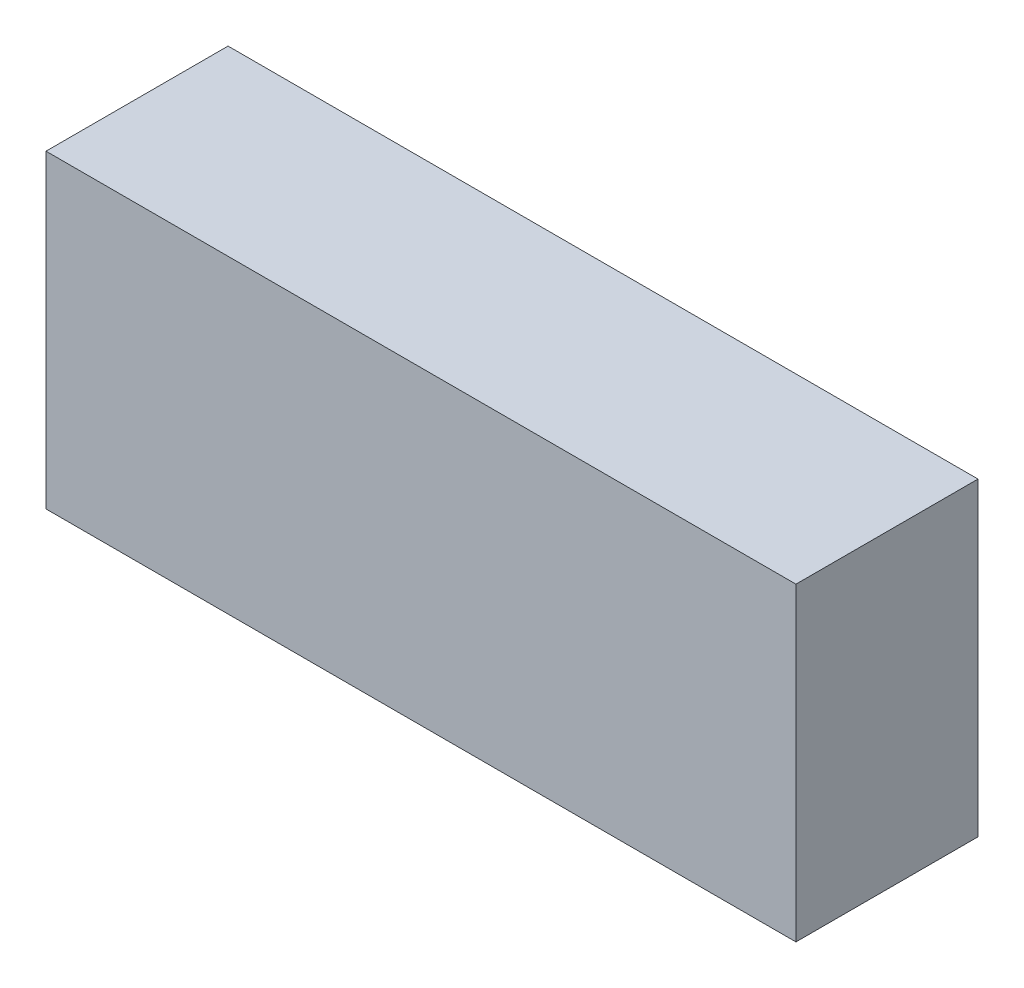
ISO-10303-21;
HEADER;
FILE_DESCRIPTION(('STEP AP214'),'2;1');
FILE_NAME('part.step','',(''),(''),'','','');
FILE_SCHEMA(('AUTOMOTIVE_DESIGN { 1 0 10303 214 1 1 1 1 }'));
ENDSEC;
DATA;
#1=APPLICATION_CONTEXT('core data for automotive mechanical design processes');
#2=APPLICATION_PROTOCOL_DEFINITION('international standard','automotive_design',2000,#1);
#3=PRODUCT_CONTEXT('',#1,'mechanical');
#4=PRODUCT('Part','Part','',(#3));
#5=PRODUCT_RELATED_PRODUCT_CATEGORY('part','',(#4));
#6=PRODUCT_DEFINITION_FORMATION('','',#4);
#7=PRODUCT_DEFINITION_CONTEXT('part definition',#1,'design');
#8=PRODUCT_DEFINITION('design','',#6,#7);
#9=PRODUCT_DEFINITION_SHAPE('','',#8);
#10=(LENGTH_UNIT() NAMED_UNIT(*) SI_UNIT(.MILLI.,.METRE.));
#11=(NAMED_UNIT(*) PLANE_ANGLE_UNIT() SI_UNIT($,.RADIAN.));
#12=(NAMED_UNIT(*) SI_UNIT($,.STERADIAN.) SOLID_ANGLE_UNIT());
#13=UNCERTAINTY_MEASURE_WITH_UNIT(LENGTH_MEASURE(1.E-05),#10,'distance_accuracy_value','');
#14=(GEOMETRIC_REPRESENTATION_CONTEXT(3) GLOBAL_UNCERTAINTY_ASSIGNED_CONTEXT((#13)) GLOBAL_UNIT_ASSIGNED_CONTEXT((#10,
#11,#12)) REPRESENTATION_CONTEXT('',''));
#15=CARTESIAN_POINT('',(0.,0.,0.));
#16=DIRECTION('',(0.,0.,1.));
#17=DIRECTION('',(1.,0.,0.));
#18=AXIS2_PLACEMENT_3D('',#15,#16,#17);
#19=CARTESIAN_POINT('',(61.7894487642175,25.5292540412383,30.));
#20=DIRECTION('',(-1.,0.,0.));
#21=DIRECTION('',(0.,0.,1.));
#22=AXIS2_PLACEMENT_3D('',#19,#20,#21);
#23=PLANE('',#22);
#24=DIRECTION('',(0.,1.,0.));
#25=VECTOR('',#24,1.);
#26=CARTESIAN_POINT('',(61.7894487642175,25.5292540412383,0.));
#27=LINE('',#26,#25);
#28=CARTESIAN_POINT('',(61.7894487642175,-25.5292540412383,0.));
#29=VERTEX_POINT('',#28);
#30=CARTESIAN_POINT('',(61.7894487642175,25.5292540412383,0.));
#31=VERTEX_POINT('',#30);
#32=EDGE_CURVE('E96',#29,#31,#27,.T.);
#33=ORIENTED_EDGE('',*,*,#32,.T.);
#34=DIRECTION('',(0.,0.,-1.));
#35=VECTOR('',#34,1.);
#36=CARTESIAN_POINT('',(61.7894487642175,25.5292540412383,30.));
#37=LINE('',#36,#35);
#38=CARTESIAN_POINT('',(61.7894487642175,25.5292540412383,30.));
#39=VERTEX_POINT('',#38);
#40=EDGE_CURVE('E11',#39,#31,#37,.T.);
#41=ORIENTED_EDGE('',*,*,#40,.F.);
#42=DIRECTION('',(0.,1.,0.));
#43=VECTOR('',#42,1.);
#44=CARTESIAN_POINT('',(61.7894487642175,25.5292540412383,30.));
#45=LINE('',#44,#43);
#46=CARTESIAN_POINT('',(61.7894487642175,-25.5292540412383,30.));
#47=VERTEX_POINT('',#46);
#48=EDGE_CURVE('E84',#47,#39,#45,.T.);
#49=ORIENTED_EDGE('',*,*,#48,.F.);
#50=DIRECTION('',(0.,0.,-1.));
#51=VECTOR('',#50,1.);
#52=CARTESIAN_POINT('',(61.7894487642175,-25.5292540412383,30.));
#53=LINE('',#52,#51);
#54=EDGE_CURVE('E92',#47,#29,#53,.T.);
#55=ORIENTED_EDGE('',*,*,#54,.T.);
#56=EDGE_LOOP('',(#33,#41,#49,#55));
#57=FACE_BOUND('',#56,.T.);
#58=ADVANCED_FACE('F33',(#57),#23,.F.);
#59=CARTESIAN_POINT('',(-61.7894487642175,25.5292540412383,30.));
#60=DIRECTION('',(0.,-1.,0.));
#61=DIRECTION('',(0.,0.,-1.));
#62=AXIS2_PLACEMENT_3D('',#59,#60,#61);
#63=PLANE('',#62);
#64=DIRECTION('',(-1.,0.,0.));
#65=VECTOR('',#64,1.);
#66=CARTESIAN_POINT('',(-61.7894487642175,25.5292540412383,0.));
#67=LINE('',#66,#65);
#68=CARTESIAN_POINT('',(-61.7894487642175,25.5292540412383,0.));
#69=VERTEX_POINT('',#68);
#70=EDGE_CURVE('E88',#31,#69,#67,.T.);
#71=ORIENTED_EDGE('',*,*,#70,.T.);
#72=DIRECTION('',(0.,0.,-1.));
#73=VECTOR('',#72,1.);
#74=CARTESIAN_POINT('',(-61.7894487642175,25.5292540412383,30.));
#75=LINE('',#74,#73);
#76=CARTESIAN_POINT('',(-61.7894487642175,25.5292540412383,30.));
#77=VERTEX_POINT('',#76);
#78=EDGE_CURVE('E41',#77,#69,#75,.T.);
#79=ORIENTED_EDGE('',*,*,#78,.F.);
#80=DIRECTION('',(-1.,0.,0.));
#81=VECTOR('',#80,1.);
#82=CARTESIAN_POINT('',(-61.7894487642175,25.5292540412383,30.));
#83=LINE('',#82,#81);
#84=EDGE_CURVE('E79',#39,#77,#83,.T.);
#85=ORIENTED_EDGE('',*,*,#84,.F.);
#86=ORIENTED_EDGE('',*,*,#40,.T.);
#87=EDGE_LOOP('',(#71,#79,#85,#86));
#88=FACE_BOUND('',#87,.T.);
#89=ADVANCED_FACE('F87',(#88),#63,.F.);
#90=CARTESIAN_POINT('',(-61.7894487642175,25.5292540412383,30.));
#91=DIRECTION('',(1.,0.,0.));
#92=DIRECTION('',(0.,0.,-1.));
#93=AXIS2_PLACEMENT_3D('',#90,#91,#92);
#94=PLANE('',#93);
#95=DIRECTION('',(0.,-1.,0.));
#96=VECTOR('',#95,1.);
#97=CARTESIAN_POINT('',(-61.7894487642175,25.5292540412383,0.));
#98=LINE('',#97,#96);
#99=CARTESIAN_POINT('',(-61.7894487642175,-25.5292540412383,0.));
#100=VERTEX_POINT('',#99);
#101=EDGE_CURVE('E66',#69,#100,#98,.T.);
#102=ORIENTED_EDGE('',*,*,#101,.T.);
#103=DIRECTION('',(0.,0.,-1.));
#104=VECTOR('',#103,1.);
#105=CARTESIAN_POINT('',(-61.7894487642175,-25.5292540412383,30.));
#106=LINE('',#105,#104);
#107=CARTESIAN_POINT('',(-61.7894487642175,-25.5292540412383,30.));
#108=VERTEX_POINT('',#107);
#109=EDGE_CURVE('E89',#108,#100,#106,.T.);
#110=ORIENTED_EDGE('',*,*,#109,.F.);
#111=DIRECTION('',(0.,-1.,0.));
#112=VECTOR('',#111,1.);
#113=CARTESIAN_POINT('',(-61.7894487642175,25.5292540412383,30.));
#114=LINE('',#113,#112);
#115=EDGE_CURVE('E82',#77,#108,#114,.T.);
#116=ORIENTED_EDGE('',*,*,#115,.F.);
#117=ORIENTED_EDGE('',*,*,#78,.T.);
#118=EDGE_LOOP('',(#102,#110,#116,#117));
#119=FACE_BOUND('',#118,.T.);
#120=ADVANCED_FACE('F90',(#119),#94,.F.);
#121=CARTESIAN_POINT('',(-61.7894487642175,-25.5292540412383,30.));
#122=DIRECTION('',(0.,1.,0.));
#123=DIRECTION('',(0.,0.,1.));
#124=AXIS2_PLACEMENT_3D('',#121,#122,#123);
#125=PLANE('',#124);
#126=DIRECTION('',(1.,0.,0.));
#127=VECTOR('',#126,1.);
#128=CARTESIAN_POINT('',(-61.7894487642175,-25.5292540412383,0.));
#129=LINE('',#128,#127);
#130=EDGE_CURVE('E72',#100,#29,#129,.T.);
#131=ORIENTED_EDGE('',*,*,#130,.T.);
#132=ORIENTED_EDGE('',*,*,#54,.F.);
#133=DIRECTION('',(1.,0.,0.));
#134=VECTOR('',#133,1.);
#135=CARTESIAN_POINT('',(-61.7894487642175,-25.5292540412383,30.));
#136=LINE('',#135,#134);
#137=EDGE_CURVE('E49',#108,#47,#136,.T.);
#138=ORIENTED_EDGE('',*,*,#137,.F.);
#139=ORIENTED_EDGE('',*,*,#109,.T.);
#140=EDGE_LOOP('',(#131,#132,#138,#139));
#141=FACE_BOUND('',#140,.T.);
#142=ADVANCED_FACE('F103',(#141),#125,.F.);
#143=CARTESIAN_POINT('',(0.,0.,30.));
#144=DIRECTION('',(0.,0.,1.));
#145=DIRECTION('',(1.,0.,0.));
#146=AXIS2_PLACEMENT_3D('',#143,#144,#145);
#147=PLANE('',#146);
#148=ORIENTED_EDGE('',*,*,#48,.T.);
#149=ORIENTED_EDGE('',*,*,#84,.T.);
#150=ORIENTED_EDGE('',*,*,#115,.T.);
#151=ORIENTED_EDGE('',*,*,#137,.T.);
#152=EDGE_LOOP('',(#148,#149,#150,#151));
#153=FACE_BOUND('',#152,.T.);
#154=ADVANCED_FACE('F80',(#153),#147,.T.);
#155=CARTESIAN_POINT('',(0.,0.,0.));
#156=DIRECTION('',(0.,0.,1.));
#157=DIRECTION('',(1.,0.,0.));
#158=AXIS2_PLACEMENT_3D('',#155,#156,#157);
#159=PLANE('',#158);
#160=ORIENTED_EDGE('',*,*,#32,.F.);
#161=ORIENTED_EDGE('',*,*,#130,.F.);
#162=ORIENTED_EDGE('',*,*,#101,.F.);
#163=ORIENTED_EDGE('',*,*,#70,.F.);
#164=EDGE_LOOP('',(#160,#161,#162,#163));
#165=FACE_BOUND('',#164,.T.);
#166=ADVANCED_FACE('F106',(#165),#159,.F.);
#167=CLOSED_SHELL('',(#58,#89,#120,#142,#154,#166));
#168=MANIFOLD_SOLID_BREP('B2',#167);
#169=ADVANCED_BREP_SHAPE_REPRESENTATION('',(#18,#168),#14);
#170=SHAPE_DEFINITION_REPRESENTATION(#9,#169);
ENDSEC;
END-ISO-10303-21;
